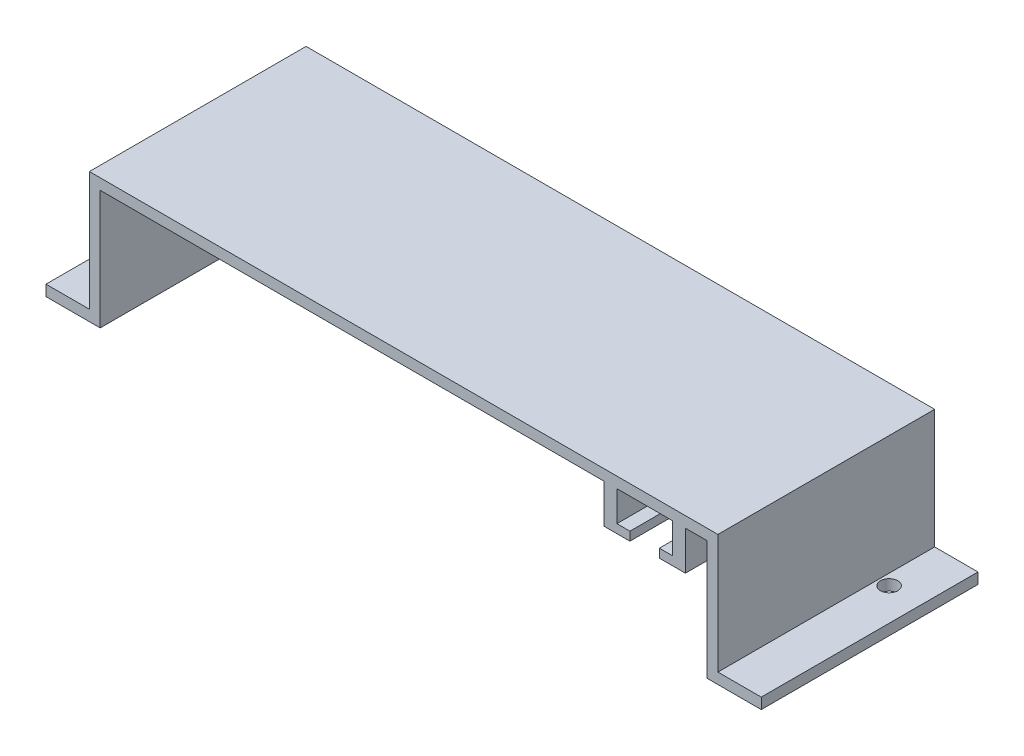
ISO-10303-21;
HEADER;
FILE_DESCRIPTION(('STEP AP214'),'2;1');
FILE_NAME('part.step','',(''),(''),'','','');
FILE_SCHEMA(('AUTOMOTIVE_DESIGN { 1 0 10303 214 1 1 1 1 }'));
ENDSEC;
DATA;
#1=APPLICATION_CONTEXT('core data for automotive mechanical design processes');
#2=APPLICATION_PROTOCOL_DEFINITION('international standard','automotive_design',2000,#1);
#3=PRODUCT_CONTEXT('',#1,'mechanical');
#4=PRODUCT('Part','Part','',(#3));
#5=PRODUCT_RELATED_PRODUCT_CATEGORY('part','',(#4));
#6=PRODUCT_DEFINITION_FORMATION('','',#4);
#7=PRODUCT_DEFINITION_CONTEXT('part definition',#1,'design');
#8=PRODUCT_DEFINITION('design','',#6,#7);
#9=PRODUCT_DEFINITION_SHAPE('','',#8);
#10=(LENGTH_UNIT() NAMED_UNIT(*) SI_UNIT(.MILLI.,.METRE.));
#11=(NAMED_UNIT(*) PLANE_ANGLE_UNIT() SI_UNIT($,.RADIAN.));
#12=(NAMED_UNIT(*) SI_UNIT($,.STERADIAN.) SOLID_ANGLE_UNIT());
#13=UNCERTAINTY_MEASURE_WITH_UNIT(LENGTH_MEASURE(1.E-05),#10,'distance_accuracy_value','');
#14=(GEOMETRIC_REPRESENTATION_CONTEXT(3) GLOBAL_UNCERTAINTY_ASSIGNED_CONTEXT((#13)) GLOBAL_UNIT_ASSIGNED_CONTEXT((#10,
#11,#12)) REPRESENTATION_CONTEXT('',''));
#15=CARTESIAN_POINT('',(0.,0.,0.));
#16=DIRECTION('',(0.,0.,1.));
#17=DIRECTION('',(1.,0.,0.));
#18=AXIS2_PLACEMENT_3D('',#15,#16,#17);
#19=CARTESIAN_POINT('',(0.,0.,0.));
#20=DIRECTION('',(0.,1.,0.));
#21=DIRECTION('',(0.,0.,1.));
#22=AXIS2_PLACEMENT_3D('',#19,#20,#21);
#23=PLANE('',#22);
#24=DIRECTION('',(1.,0.,0.));
#25=VECTOR('',#24,1.);
#26=CARTESIAN_POINT('',(-88.8999999999999,0.,31.75));
#27=LINE('',#26,#25);
#28=CARTESIAN_POINT('',(82.55,0.,31.75));
#29=VERTEX_POINT('',#28);
#30=CARTESIAN_POINT('',(88.9,0.,31.75));
#31=VERTEX_POINT('',#30);
#32=EDGE_CURVE('E237',#29,#31,#27,.T.);
#33=ORIENTED_EDGE('',*,*,#32,.F.);
#34=DIRECTION('',(0.,0.,1.));
#35=VECTOR('',#34,1.);
#36=CARTESIAN_POINT('',(82.55,0.,-45.4871503595178));
#37=LINE('',#36,#35);
#38=CARTESIAN_POINT('',(82.55,0.,-31.75));
#39=VERTEX_POINT('',#38);
#40=EDGE_CURVE('E447',#39,#29,#37,.T.);
#41=ORIENTED_EDGE('',*,*,#40,.F.);
#42=DIRECTION('',(-1.,0.,0.));
#43=VECTOR('',#42,1.);
#44=CARTESIAN_POINT('',(-88.9,0.,-31.75));
#45=LINE('',#44,#43);
#46=CARTESIAN_POINT('',(88.9,0.,-31.75));
#47=VERTEX_POINT('',#46);
#48=EDGE_CURVE('E352',#47,#39,#45,.T.);
#49=ORIENTED_EDGE('',*,*,#48,.F.);
#50=DIRECTION('',(0.,0.,-1.));
#51=VECTOR('',#50,1.);
#52=CARTESIAN_POINT('',(88.9,0.,-31.75));
#53=LINE('',#52,#51);
#54=EDGE_CURVE('E336',#31,#47,#53,.T.);
#55=ORIENTED_EDGE('',*,*,#54,.F.);
#56=EDGE_LOOP('',(#33,#41,#49,#55));
#57=FACE_BOUND('',#56,.T.);
#58=ADVANCED_FACE('F41',(#57),#23,.F.);
#59=CARTESIAN_POINT('',(78.74,0.,-31.75));
#60=VERTEX_POINT('',#59);
#61=CARTESIAN_POINT('',(62.484,0.,-31.75));
#62=VERTEX_POINT('',#61);
#63=EDGE_CURVE('E226',#60,#62,#45,.T.);
#64=ORIENTED_EDGE('',*,*,#63,.F.);
#65=DIRECTION('',(0.,0.,1.));
#66=VECTOR('',#65,1.);
#67=CARTESIAN_POINT('',(78.74,0.,-45.4871503595178));
#68=LINE('',#67,#66);
#69=CARTESIAN_POINT('',(78.74,0.,31.75));
#70=VERTEX_POINT('',#69);
#71=EDGE_CURVE('E211',#60,#70,#68,.T.);
#72=ORIENTED_EDGE('',*,*,#71,.T.);
#73=CARTESIAN_POINT('',(62.484,0.,31.75));
#74=VERTEX_POINT('',#73);
#75=EDGE_CURVE('E225',#74,#70,#27,.T.);
#76=ORIENTED_EDGE('',*,*,#75,.F.);
#77=DIRECTION('',(0.,0.,1.));
#78=VECTOR('',#77,1.);
#79=CARTESIAN_POINT('',(62.484,0.,-45.4871503595178));
#80=LINE('',#79,#78);
#81=EDGE_CURVE('E478',#62,#74,#80,.T.);
#82=ORIENTED_EDGE('',*,*,#81,.F.);
#83=EDGE_LOOP('',(#64,#72,#76,#82));
#84=FACE_BOUND('',#83,.T.);
#85=ADVANCED_FACE('F223',(#84),#23,.F.);
#86=CARTESIAN_POINT('',(-92.0749999999999,-34.925,-31.75));
#87=DIRECTION('',(-1.,0.,0.));
#88=DIRECTION('',(0.,0.,1.));
#89=AXIS2_PLACEMENT_3D('',#86,#87,#88);
#90=PLANE('',#89);
#91=DIRECTION('',(0.,1.,0.));
#92=VECTOR('',#91,1.);
#93=CARTESIAN_POINT('',(-92.0749999999999,-34.925,-31.75));
#94=LINE('',#93,#92);
#95=CARTESIAN_POINT('',(-92.0749999999999,-31.75,-31.75));
#96=VERTEX_POINT('',#95);
#97=CARTESIAN_POINT('',(-92.0749999999999,3.175,-31.75));
#98=VERTEX_POINT('',#97);
#99=EDGE_CURVE('E340',#96,#98,#94,.T.);
#100=ORIENTED_EDGE('',*,*,#99,.F.);
#101=DIRECTION('',(0.,0.,1.));
#102=VECTOR('',#101,1.);
#103=CARTESIAN_POINT('',(-92.0749999999999,-31.75,31.75));
#104=LINE('',#103,#102);
#105=CARTESIAN_POINT('',(-92.0749999999999,-31.75,31.75));
#106=VERTEX_POINT('',#105);
#107=EDGE_CURVE('E382',#96,#106,#104,.T.);
#108=ORIENTED_EDGE('',*,*,#107,.T.);
#109=DIRECTION('',(0.,1.,0.));
#110=VECTOR('',#109,1.);
#111=CARTESIAN_POINT('',(-92.0749999999999,-34.925,31.75));
#112=LINE('',#111,#110);
#113=CARTESIAN_POINT('',(-92.0749999999999,3.175,31.75));
#114=VERTEX_POINT('',#113);
#115=EDGE_CURVE('E337',#106,#114,#112,.T.);
#116=ORIENTED_EDGE('',*,*,#115,.T.);
#117=DIRECTION('',(0.,0.,1.));
#118=VECTOR('',#117,1.);
#119=CARTESIAN_POINT('',(-92.0749999999999,3.175,-31.75));
#120=LINE('',#119,#118);
#121=EDGE_CURVE('E307',#98,#114,#120,.T.);
#122=ORIENTED_EDGE('',*,*,#121,.F.);
#123=EDGE_LOOP('',(#100,#108,#116,#122));
#124=FACE_BOUND('',#123,.T.);
#125=ADVANCED_FACE('F420',(#124),#90,.T.);
#126=CARTESIAN_POINT('',(-88.9,3.175,-31.75));
#127=DIRECTION('',(0.,0.,1.));
#128=DIRECTION('',(1.,0.,0.));
#129=AXIS2_PLACEMENT_3D('',#126,#127,#128);
#130=PLANE('',#129);
#131=ORIENTED_EDGE('',*,*,#48,.T.);
#132=DIRECTION('',(0.,-1.,0.));
#133=VECTOR('',#132,1.);
#134=CARTESIAN_POINT('',(82.55,0.,-31.75));
#135=LINE('',#134,#133);
#136=CARTESIAN_POINT('',(82.55,-11.43,-31.75));
#137=VERTEX_POINT('',#136);
#138=EDGE_CURVE('E473',#39,#137,#135,.T.);
#139=ORIENTED_EDGE('',*,*,#138,.T.);
#140=DIRECTION('',(-1.,0.,0.));
#141=VECTOR('',#140,1.);
#142=CARTESIAN_POINT('',(82.55,-11.43,-31.75));
#143=LINE('',#142,#141);
#144=CARTESIAN_POINT('',(74.93,-11.43,-31.75));
#145=VERTEX_POINT('',#144);
#146=EDGE_CURVE('E834',#137,#145,#143,.T.);
#147=ORIENTED_EDGE('',*,*,#146,.T.);
#148=DIRECTION('',(0.,1.,0.));
#149=VECTOR('',#148,1.);
#150=CARTESIAN_POINT('',(74.93,-11.43,-31.75));
#151=LINE('',#150,#149);
#152=CARTESIAN_POINT('',(74.93,-8.88999999999999,-31.75));
#153=VERTEX_POINT('',#152);
#154=EDGE_CURVE('E455',#145,#153,#151,.T.);
#155=ORIENTED_EDGE('',*,*,#154,.T.);
#156=DIRECTION('',(1.,0.,0.));
#157=VECTOR('',#156,1.);
#158=CARTESIAN_POINT('',(74.93,-8.88999999999999,-31.75));
#159=LINE('',#158,#157);
#160=CARTESIAN_POINT('',(78.74,-8.88999999999998,-31.75));
#161=VERTEX_POINT('',#160);
#162=EDGE_CURVE('E450',#153,#161,#159,.T.);
#163=ORIENTED_EDGE('',*,*,#162,.T.);
#164=DIRECTION('',(0.,1.,0.));
#165=VECTOR('',#164,1.);
#166=CARTESIAN_POINT('',(78.74,-8.88999999999998,-31.75));
#167=LINE('',#166,#165);
#168=EDGE_CURVE('E469',#161,#60,#167,.T.);
#169=ORIENTED_EDGE('',*,*,#168,.T.);
#170=ORIENTED_EDGE('',*,*,#63,.T.);
#171=DIRECTION('',(0.,-1.,0.));
#172=VECTOR('',#171,1.);
#173=CARTESIAN_POINT('',(62.484,-8.88999999999999,-31.75));
#174=LINE('',#173,#172);
#175=CARTESIAN_POINT('',(62.484,-8.88999999999999,-31.75));
#176=VERTEX_POINT('',#175);
#177=EDGE_CURVE('E412',#62,#176,#174,.T.);
#178=ORIENTED_EDGE('',*,*,#177,.T.);
#179=DIRECTION('',(1.,0.,0.));
#180=VECTOR('',#179,1.);
#181=CARTESIAN_POINT('',(66.294,-8.88999999999999,-31.75));
#182=LINE('',#181,#180);
#183=CARTESIAN_POINT('',(66.294,-8.88999999999999,-31.75));
#184=VERTEX_POINT('',#183);
#185=EDGE_CURVE('E481',#176,#184,#182,.T.);
#186=ORIENTED_EDGE('',*,*,#185,.T.);
#187=DIRECTION('',(0.,-1.,0.));
#188=VECTOR('',#187,1.);
#189=CARTESIAN_POINT('',(66.294,-11.43,-31.75));
#190=LINE('',#189,#188);
#191=CARTESIAN_POINT('',(66.294,-11.43,-31.75));
#192=VERTEX_POINT('',#191);
#193=EDGE_CURVE('E477',#184,#192,#190,.T.);
#194=ORIENTED_EDGE('',*,*,#193,.T.);
#195=DIRECTION('',(-1.,0.,0.));
#196=VECTOR('',#195,1.);
#197=CARTESIAN_POINT('',(58.674,-11.43,-31.75));
#198=LINE('',#197,#196);
#199=CARTESIAN_POINT('',(58.674,-11.43,-31.75));
#200=VERTEX_POINT('',#199);
#201=EDGE_CURVE('E474',#192,#200,#198,.T.);
#202=ORIENTED_EDGE('',*,*,#201,.T.);
#203=DIRECTION('',(0.,1.,0.));
#204=VECTOR('',#203,1.);
#205=CARTESIAN_POINT('',(58.674,0.,-31.75));
#206=LINE('',#205,#204);
#207=CARTESIAN_POINT('',(58.674,0.,-31.75));
#208=VERTEX_POINT('',#207);
#209=EDGE_CURVE('E363',#200,#208,#206,.T.);
#210=ORIENTED_EDGE('',*,*,#209,.T.);
#211=CARTESIAN_POINT('',(-88.9,0.,-31.75));
#212=VERTEX_POINT('',#211);
#213=EDGE_CURVE('E351',#208,#212,#45,.T.);
#214=ORIENTED_EDGE('',*,*,#213,.T.);
#215=DIRECTION('',(0.,1.,0.));
#216=VECTOR('',#215,1.);
#217=CARTESIAN_POINT('',(-88.9,-34.925,-31.75));
#218=LINE('',#217,#216);
#219=CARTESIAN_POINT('',(-88.9,-34.925,-31.75));
#220=VERTEX_POINT('',#219);
#221=EDGE_CURVE('E328',#220,#212,#218,.T.);
#222=ORIENTED_EDGE('',*,*,#221,.F.);
#223=DIRECTION('',(-1.,0.,0.));
#224=VECTOR('',#223,1.);
#225=CARTESIAN_POINT('',(-88.9,-34.925,-31.75));
#226=LINE('',#225,#224);
#227=CARTESIAN_POINT('',(-104.775,-34.925,-31.75));
#228=VERTEX_POINT('',#227);
#229=EDGE_CURVE('E321',#220,#228,#226,.T.);
#230=ORIENTED_EDGE('',*,*,#229,.T.);
#231=DIRECTION('',(0.,1.,0.));
#232=VECTOR('',#231,1.);
#233=CARTESIAN_POINT('',(-104.775,-34.925,-31.75));
#234=LINE('',#233,#232);
#235=CARTESIAN_POINT('',(-104.775,-31.75,-31.75));
#236=VERTEX_POINT('',#235);
#237=EDGE_CURVE('E388',#228,#236,#234,.T.);
#238=ORIENTED_EDGE('',*,*,#237,.T.);
#239=DIRECTION('',(1.,0.,0.));
#240=VECTOR('',#239,1.);
#241=CARTESIAN_POINT('',(-104.775,-31.75,-31.75));
#242=LINE('',#241,#240);
#243=EDGE_CURVE('E262',#236,#96,#242,.T.);
#244=ORIENTED_EDGE('',*,*,#243,.T.);
#245=ORIENTED_EDGE('',*,*,#99,.T.);
#246=DIRECTION('',(-1.,0.,0.));
#247=VECTOR('',#246,1.);
#248=CARTESIAN_POINT('',(-88.9,3.175,-31.75));
#249=LINE('',#248,#247);
#250=CARTESIAN_POINT('',(92.0749999999999,3.175,-31.75));
#251=VERTEX_POINT('',#250);
#252=EDGE_CURVE('E51',#251,#98,#249,.T.);
#253=ORIENTED_EDGE('',*,*,#252,.F.);
#254=DIRECTION('',(0.,1.,0.));
#255=VECTOR('',#254,1.);
#256=CARTESIAN_POINT('',(92.0749999999999,-34.925,-31.75));
#257=LINE('',#256,#255);
#258=CARTESIAN_POINT('',(92.0749999999999,-31.75,-31.75));
#259=VERTEX_POINT('',#258);
#260=EDGE_CURVE('E308',#259,#251,#257,.T.);
#261=ORIENTED_EDGE('',*,*,#260,.F.);
#262=DIRECTION('',(-1.,0.,0.));
#263=VECTOR('',#262,1.);
#264=CARTESIAN_POINT('',(104.775,-31.75,-31.75));
#265=LINE('',#264,#263);
#266=CARTESIAN_POINT('',(104.775,-31.75,-31.75));
#267=VERTEX_POINT('',#266);
#268=EDGE_CURVE('E283',#267,#259,#265,.T.);
#269=ORIENTED_EDGE('',*,*,#268,.F.);
#270=DIRECTION('',(0.,1.,0.));
#271=VECTOR('',#270,1.);
#272=CARTESIAN_POINT('',(104.775,-34.925,-31.75));
#273=LINE('',#272,#271);
#274=CARTESIAN_POINT('',(104.775,-34.925,-31.75));
#275=VERTEX_POINT('',#274);
#276=EDGE_CURVE('E273',#275,#267,#273,.T.);
#277=ORIENTED_EDGE('',*,*,#276,.F.);
#278=DIRECTION('',(-1.,0.,0.));
#279=VECTOR('',#278,1.);
#280=CARTESIAN_POINT('',(88.9,-34.925,-31.75));
#281=LINE('',#280,#279);
#282=CARTESIAN_POINT('',(88.9,-34.925,-31.75));
#283=VERTEX_POINT('',#282);
#284=EDGE_CURVE('E295',#275,#283,#281,.T.);
#285=ORIENTED_EDGE('',*,*,#284,.T.);
#286=DIRECTION('',(0.,1.,0.));
#287=VECTOR('',#286,1.);
#288=CARTESIAN_POINT('',(88.9,-34.925,-31.75));
#289=LINE('',#288,#287);
#290=EDGE_CURVE('E303',#283,#47,#289,.T.);
#291=ORIENTED_EDGE('',*,*,#290,.T.);
#292=EDGE_LOOP('',(#131,#139,#147,#155,#163,#169,#170,#178,#186,#194,#202,#210,#214,#222,#230,
#238,#244,#245,#253,#261,#269,#277,#285,#291));
#293=FACE_BOUND('',#292,.T.);
#294=ADVANCED_FACE('F43',(#293),#130,.F.);
#295=CARTESIAN_POINT('',(-88.8999999999999,3.175,31.75));
#296=DIRECTION('',(0.,0.,-1.));
#297=DIRECTION('',(-1.,0.,0.));
#298=AXIS2_PLACEMENT_3D('',#295,#296,#297);
#299=PLANE('',#298);
#300=CARTESIAN_POINT('',(-88.8999999999999,0.,31.75));
#301=VERTEX_POINT('',#300);
#302=CARTESIAN_POINT('',(58.674,0.,31.75));
#303=VERTEX_POINT('',#302);
#304=EDGE_CURVE('E236',#301,#303,#27,.T.);
#305=ORIENTED_EDGE('',*,*,#304,.T.);
#306=DIRECTION('',(0.,-1.,0.));
#307=VECTOR('',#306,1.);
#308=CARTESIAN_POINT('',(58.674,0.,31.75));
#309=LINE('',#308,#307);
#310=CARTESIAN_POINT('',(58.674,-11.43,31.75));
#311=VERTEX_POINT('',#310);
#312=EDGE_CURVE('E472',#303,#311,#309,.T.);
#313=ORIENTED_EDGE('',*,*,#312,.T.);
#314=DIRECTION('',(1.,0.,0.));
#315=VECTOR('',#314,1.);
#316=CARTESIAN_POINT('',(58.674,-11.43,31.75));
#317=LINE('',#316,#315);
#318=CARTESIAN_POINT('',(66.294,-11.43,31.75));
#319=VERTEX_POINT('',#318);
#320=EDGE_CURVE('E489',#311,#319,#317,.T.);
#321=ORIENTED_EDGE('',*,*,#320,.T.);
#322=DIRECTION('',(0.,1.,0.));
#323=VECTOR('',#322,1.);
#324=CARTESIAN_POINT('',(66.294,-11.43,31.75));
#325=LINE('',#324,#323);
#326=CARTESIAN_POINT('',(66.294,-8.88999999999999,31.75));
#327=VERTEX_POINT('',#326);
#328=EDGE_CURVE('E493',#319,#327,#325,.T.);
#329=ORIENTED_EDGE('',*,*,#328,.T.);
#330=DIRECTION('',(-1.,0.,0.));
#331=VECTOR('',#330,1.);
#332=CARTESIAN_POINT('',(66.294,-8.88999999999999,31.75));
#333=LINE('',#332,#331);
#334=CARTESIAN_POINT('',(62.484,-8.88999999999999,31.75));
#335=VERTEX_POINT('',#334);
#336=EDGE_CURVE('E497',#327,#335,#333,.T.);
#337=ORIENTED_EDGE('',*,*,#336,.T.);
#338=DIRECTION('',(0.,1.,0.));
#339=VECTOR('',#338,1.);
#340=CARTESIAN_POINT('',(62.484,-8.88999999999999,31.75));
#341=LINE('',#340,#339);
#342=EDGE_CURVE('E234',#335,#74,#341,.T.);
#343=ORIENTED_EDGE('',*,*,#342,.T.);
#344=ORIENTED_EDGE('',*,*,#75,.T.);
#345=DIRECTION('',(0.,-1.,0.));
#346=VECTOR('',#345,1.);
#347=CARTESIAN_POINT('',(78.74,-8.88999999999998,31.75));
#348=LINE('',#347,#346);
#349=CARTESIAN_POINT('',(78.74,-8.88999999999998,31.75));
#350=VERTEX_POINT('',#349);
#351=EDGE_CURVE('E207',#70,#350,#348,.T.);
#352=ORIENTED_EDGE('',*,*,#351,.T.);
#353=DIRECTION('',(-1.,0.,0.));
#354=VECTOR('',#353,1.);
#355=CARTESIAN_POINT('',(74.93,-8.88999999999999,31.75));
#356=LINE('',#355,#354);
#357=CARTESIAN_POINT('',(74.93,-8.88999999999999,31.75));
#358=VERTEX_POINT('',#357);
#359=EDGE_CURVE('E219',#350,#358,#356,.T.);
#360=ORIENTED_EDGE('',*,*,#359,.T.);
#361=DIRECTION('',(0.,-1.,0.));
#362=VECTOR('',#361,1.);
#363=CARTESIAN_POINT('',(74.93,-11.43,31.75));
#364=LINE('',#363,#362);
#365=CARTESIAN_POINT('',(74.93,-11.43,31.75));
#366=VERTEX_POINT('',#365);
#367=EDGE_CURVE('E822',#358,#366,#364,.T.);
#368=ORIENTED_EDGE('',*,*,#367,.T.);
#369=DIRECTION('',(1.,0.,0.));
#370=VECTOR('',#369,1.);
#371=CARTESIAN_POINT('',(82.55,-11.43,31.75));
#372=LINE('',#371,#370);
#373=CARTESIAN_POINT('',(82.55,-11.43,31.75));
#374=VERTEX_POINT('',#373);
#375=EDGE_CURVE('E825',#366,#374,#372,.T.);
#376=ORIENTED_EDGE('',*,*,#375,.T.);
#377=DIRECTION('',(0.,1.,0.));
#378=VECTOR('',#377,1.);
#379=CARTESIAN_POINT('',(82.55,0.,31.75));
#380=LINE('',#379,#378);
#381=EDGE_CURVE('E59',#374,#29,#380,.T.);
#382=ORIENTED_EDGE('',*,*,#381,.T.);
#383=ORIENTED_EDGE('',*,*,#32,.T.);
#384=DIRECTION('',(0.,1.,0.));
#385=VECTOR('',#384,1.);
#386=CARTESIAN_POINT('',(88.8999999999999,-34.925,31.75));
#387=LINE('',#386,#385);
#388=CARTESIAN_POINT('',(88.8999999999999,-34.925,31.75));
#389=VERTEX_POINT('',#388);
#390=EDGE_CURVE('E299',#389,#31,#387,.T.);
#391=ORIENTED_EDGE('',*,*,#390,.F.);
#392=DIRECTION('',(1.,0.,0.));
#393=VECTOR('',#392,1.);
#394=CARTESIAN_POINT('',(88.8999999999999,-34.925,31.75));
#395=LINE('',#394,#393);
#396=CARTESIAN_POINT('',(104.775,-34.925,31.75));
#397=VERTEX_POINT('',#396);
#398=EDGE_CURVE('E292',#389,#397,#395,.T.);
#399=ORIENTED_EDGE('',*,*,#398,.T.);
#400=DIRECTION('',(0.,-1.,0.));
#401=VECTOR('',#400,1.);
#402=CARTESIAN_POINT('',(104.775,-34.925,31.75));
#403=LINE('',#402,#401);
#404=CARTESIAN_POINT('',(104.775,-31.75,31.75));
#405=VERTEX_POINT('',#404);
#406=EDGE_CURVE('E254',#405,#397,#403,.T.);
#407=ORIENTED_EDGE('',*,*,#406,.F.);
#408=DIRECTION('',(-1.,0.,0.));
#409=VECTOR('',#408,1.);
#410=CARTESIAN_POINT('',(104.775,-31.75,31.75));
#411=LINE('',#410,#409);
#412=CARTESIAN_POINT('',(92.0749999999999,-31.75,31.75));
#413=VERTEX_POINT('',#412);
#414=EDGE_CURVE('E278',#405,#413,#411,.T.);
#415=ORIENTED_EDGE('',*,*,#414,.T.);
#416=DIRECTION('',(0.,1.,0.));
#417=VECTOR('',#416,1.);
#418=CARTESIAN_POINT('',(92.0749999999999,-34.925,31.75));
#419=LINE('',#418,#417);
#420=CARTESIAN_POINT('',(92.0749999999999,3.175,31.75));
#421=VERTEX_POINT('',#420);
#422=EDGE_CURVE('E311',#413,#421,#419,.T.);
#423=ORIENTED_EDGE('',*,*,#422,.T.);
#424=DIRECTION('',(1.,0.,0.));
#425=VECTOR('',#424,1.);
#426=CARTESIAN_POINT('',(-88.8999999999999,3.175,31.75));
#427=LINE('',#426,#425);
#428=EDGE_CURVE('E11',#114,#421,#427,.T.);
#429=ORIENTED_EDGE('',*,*,#428,.F.);
#430=ORIENTED_EDGE('',*,*,#115,.F.);
#431=DIRECTION('',(1.,0.,0.));
#432=VECTOR('',#431,1.);
#433=CARTESIAN_POINT('',(-104.775,-31.75,31.75));
#434=LINE('',#433,#432);
#435=CARTESIAN_POINT('',(-104.775,-31.75,31.75));
#436=VERTEX_POINT('',#435);
#437=EDGE_CURVE('E257',#436,#106,#434,.T.);
#438=ORIENTED_EDGE('',*,*,#437,.F.);
#439=DIRECTION('',(0.,-1.,0.));
#440=VECTOR('',#439,1.);
#441=CARTESIAN_POINT('',(-104.775,-34.925,31.75));
#442=LINE('',#441,#440);
#443=CARTESIAN_POINT('',(-104.775,-34.925,31.75));
#444=VERTEX_POINT('',#443);
#445=EDGE_CURVE('E374',#436,#444,#442,.T.);
#446=ORIENTED_EDGE('',*,*,#445,.T.);
#447=DIRECTION('',(1.,0.,0.));
#448=VECTOR('',#447,1.);
#449=CARTESIAN_POINT('',(-88.8999999999999,-34.925,31.75));
#450=LINE('',#449,#448);
#451=CARTESIAN_POINT('',(-88.8999999999999,-34.925,31.75));
#452=VERTEX_POINT('',#451);
#453=EDGE_CURVE('E324',#444,#452,#450,.T.);
#454=ORIENTED_EDGE('',*,*,#453,.T.);
#455=DIRECTION('',(0.,1.,0.));
#456=VECTOR('',#455,1.);
#457=CARTESIAN_POINT('',(-88.8999999999999,-34.925,31.75));
#458=LINE('',#457,#456);
#459=EDGE_CURVE('E332',#452,#301,#458,.T.);
#460=ORIENTED_EDGE('',*,*,#459,.T.);
#461=EDGE_LOOP('',(#305,#313,#321,#329,#337,#343,#344,#352,#360,#368,#376,#382,#383,#391,#399,
#407,#415,#423,#429,#430,#438,#446,#454,#460));
#462=FACE_BOUND('',#461,.T.);
#463=ADVANCED_FACE('F231',(#462),#299,.F.);
#464=CARTESIAN_POINT('',(0.,3.175,0.));
#465=DIRECTION('',(0.,1.,0.));
#466=DIRECTION('',(0.,0.,1.));
#467=AXIS2_PLACEMENT_3D('',#464,#465,#466);
#468=PLANE('',#467);
#469=ORIENTED_EDGE('',*,*,#428,.T.);
#470=DIRECTION('',(0.,0.,-1.));
#471=VECTOR('',#470,1.);
#472=CARTESIAN_POINT('',(92.0749999999999,3.175,-31.75));
#473=LINE('',#472,#471);
#474=EDGE_CURVE('E287',#421,#251,#473,.T.);
#475=ORIENTED_EDGE('',*,*,#474,.T.);
#476=ORIENTED_EDGE('',*,*,#252,.T.);
#477=ORIENTED_EDGE('',*,*,#121,.T.);
#478=EDGE_LOOP('',(#469,#475,#476,#477));
#479=FACE_BOUND('',#478,.T.);
#480=ADVANCED_FACE('F423',(#479),#468,.T.);
#481=ORIENTED_EDGE('',*,*,#213,.F.);
#482=DIRECTION('',(0.,0.,1.));
#483=VECTOR('',#482,1.);
#484=CARTESIAN_POINT('',(58.674,0.,-45.4871503595178));
#485=LINE('',#484,#483);
#486=EDGE_CURVE('E67',#208,#303,#485,.T.);
#487=ORIENTED_EDGE('',*,*,#486,.T.);
#488=ORIENTED_EDGE('',*,*,#304,.F.);
#489=DIRECTION('',(0.,0.,1.));
#490=VECTOR('',#489,1.);
#491=CARTESIAN_POINT('',(-88.9,0.,-31.75));
#492=LINE('',#491,#490);
#493=EDGE_CURVE('E241',#212,#301,#492,.T.);
#494=ORIENTED_EDGE('',*,*,#493,.F.);
#495=EDGE_LOOP('',(#481,#487,#488,#494));
#496=FACE_BOUND('',#495,.T.);
#497=ADVANCED_FACE('F365',(#496),#23,.F.);
#498=CARTESIAN_POINT('',(-88.9,-34.925,-31.75));
#499=DIRECTION('',(1.,0.,0.));
#500=DIRECTION('',(0.,0.,-1.));
#501=AXIS2_PLACEMENT_3D('',#498,#499,#500);
#502=PLANE('',#501);
#503=ORIENTED_EDGE('',*,*,#221,.T.);
#504=ORIENTED_EDGE('',*,*,#493,.T.);
#505=ORIENTED_EDGE('',*,*,#459,.F.);
#506=DIRECTION('',(0.,0.,-1.));
#507=VECTOR('',#506,1.);
#508=CARTESIAN_POINT('',(-88.9,-34.925,-31.75));
#509=LINE('',#508,#507);
#510=EDGE_CURVE('E317',#452,#220,#509,.T.);
#511=ORIENTED_EDGE('',*,*,#510,.T.);
#512=EDGE_LOOP('',(#503,#504,#505,#511));
#513=FACE_BOUND('',#512,.T.);
#514=ADVANCED_FACE('F367',(#513),#502,.T.);
#515=CARTESIAN_POINT('',(0.,-34.925,0.));
#516=DIRECTION('',(0.,-1.,0.));
#517=DIRECTION('',(0.,0.,-1.));
#518=AXIS2_PLACEMENT_3D('',#515,#516,#517);
#519=PLANE('',#518);
#520=CARTESIAN_POINT('',(-95.25,-34.925,-15.24));
#521=DIRECTION('',(0.,1.,0.));
#522=DIRECTION('',(0.,0.,-1.));
#523=AXIS2_PLACEMENT_3D('',#520,#521,#522);
#524=CIRCLE('',#523,2.54);
#525=CARTESIAN_POINT('',(-95.25,-34.925,-17.78));
#526=VERTEX_POINT('',#525);
#527=EDGE_CURVE('E403',#526,#526,#524,.T.);
#528=ORIENTED_EDGE('',*,*,#527,.T.);
#529=EDGE_LOOP('',(#528));
#530=FACE_BOUND('',#529,.T.);
#531=ORIENTED_EDGE('',*,*,#510,.F.);
#532=ORIENTED_EDGE('',*,*,#453,.F.);
#533=DIRECTION('',(0.,0.,-1.));
#534=VECTOR('',#533,1.);
#535=CARTESIAN_POINT('',(-104.775,-34.925,31.75));
#536=LINE('',#535,#534);
#537=EDGE_CURVE('E385',#444,#228,#536,.T.);
#538=ORIENTED_EDGE('',*,*,#537,.T.);
#539=ORIENTED_EDGE('',*,*,#229,.F.);
#540=EDGE_LOOP('',(#531,#532,#538,#539));
#541=FACE_BOUND('',#540,.T.);
#542=ADVANCED_FACE('F370',(#530,#541),#519,.T.);
#543=CARTESIAN_POINT('',(88.9,-34.925,-31.75));
#544=DIRECTION('',(-1.,0.,0.));
#545=DIRECTION('',(0.,0.,1.));
#546=AXIS2_PLACEMENT_3D('',#543,#544,#545);
#547=PLANE('',#546);
#548=ORIENTED_EDGE('',*,*,#390,.T.);
#549=ORIENTED_EDGE('',*,*,#54,.T.);
#550=ORIENTED_EDGE('',*,*,#290,.F.);
#551=DIRECTION('',(0.,0.,1.));
#552=VECTOR('',#551,1.);
#553=CARTESIAN_POINT('',(88.9,-34.925,-31.75));
#554=LINE('',#553,#552);
#555=EDGE_CURVE('E288',#283,#389,#554,.T.);
#556=ORIENTED_EDGE('',*,*,#555,.T.);
#557=EDGE_LOOP('',(#548,#549,#550,#556));
#558=FACE_BOUND('',#557,.T.);
#559=ADVANCED_FACE('F442',(#558),#547,.T.);
#560=CARTESIAN_POINT('',(92.0749999999999,-34.925,-31.75));
#561=DIRECTION('',(1.,0.,0.));
#562=DIRECTION('',(0.,0.,-1.));
#563=AXIS2_PLACEMENT_3D('',#560,#561,#562);
#564=PLANE('',#563);
#565=DIRECTION('',(0.,0.,1.));
#566=VECTOR('',#565,1.);
#567=CARTESIAN_POINT('',(92.0749999999999,-31.75,31.75));
#568=LINE('',#567,#566);
#569=EDGE_CURVE('E247',#259,#413,#568,.T.);
#570=ORIENTED_EDGE('',*,*,#569,.F.);
#571=ORIENTED_EDGE('',*,*,#260,.T.);
#572=ORIENTED_EDGE('',*,*,#474,.F.);
#573=ORIENTED_EDGE('',*,*,#422,.F.);
#574=EDGE_LOOP('',(#570,#571,#572,#573));
#575=FACE_BOUND('',#574,.T.);
#576=ADVANCED_FACE('F567',(#575),#564,.T.);
#577=CARTESIAN_POINT('',(0.,-34.925,0.));
#578=DIRECTION('',(0.,1.,0.));
#579=DIRECTION('',(0.,0.,1.));
#580=AXIS2_PLACEMENT_3D('',#577,#578,#579);
#581=PLANE('',#580);
#582=CARTESIAN_POINT('',(95.25,-34.925,-15.24));
#583=DIRECTION('',(0.,-1.,0.));
#584=DIRECTION('',(0.,0.,-1.));
#585=AXIS2_PLACEMENT_3D('',#582,#583,#584);
#586=CIRCLE('',#585,2.54);
#587=CARTESIAN_POINT('',(95.25,-34.925,-17.78));
#588=VERTEX_POINT('',#587);
#589=EDGE_CURVE('E248',#588,#588,#586,.T.);
#590=ORIENTED_EDGE('',*,*,#589,.F.);
#591=EDGE_LOOP('',(#590));
#592=FACE_BOUND('',#591,.T.);
#593=ORIENTED_EDGE('',*,*,#555,.F.);
#594=ORIENTED_EDGE('',*,*,#284,.F.);
#595=DIRECTION('',(0.,0.,-1.));
#596=VECTOR('',#595,1.);
#597=CARTESIAN_POINT('',(104.775,-34.925,31.75));
#598=LINE('',#597,#596);
#599=EDGE_CURVE('E269',#397,#275,#598,.T.);
#600=ORIENTED_EDGE('',*,*,#599,.F.);
#601=ORIENTED_EDGE('',*,*,#398,.F.);
#602=EDGE_LOOP('',(#593,#594,#600,#601));
#603=FACE_BOUND('',#602,.T.);
#604=ADVANCED_FACE('F439',(#592,#603),#581,.F.);
#605=CARTESIAN_POINT('',(104.775,-31.75,31.75));
#606=DIRECTION('',(0.,-1.,0.));
#607=DIRECTION('',(0.,0.,-1.));
#608=AXIS2_PLACEMENT_3D('',#605,#606,#607);
#609=PLANE('',#608);
#610=CARTESIAN_POINT('',(95.25,-31.75,-15.24));
#611=DIRECTION('',(0.,-1.,0.));
#612=DIRECTION('',(0.,0.,-1.));
#613=AXIS2_PLACEMENT_3D('',#610,#611,#612);
#614=CIRCLE('',#613,2.54);
#615=CARTESIAN_POINT('',(95.25,-31.75,-17.78));
#616=VERTEX_POINT('',#615);
#617=EDGE_CURVE('E244',#616,#616,#614,.T.);
#618=ORIENTED_EDGE('',*,*,#617,.T.);
#619=EDGE_LOOP('',(#618));
#620=FACE_BOUND('',#619,.T.);
#621=ORIENTED_EDGE('',*,*,#569,.T.);
#622=ORIENTED_EDGE('',*,*,#414,.F.);
#623=DIRECTION('',(0.,0.,1.));
#624=VECTOR('',#623,1.);
#625=CARTESIAN_POINT('',(104.775,-31.75,31.75));
#626=LINE('',#625,#624);
#627=EDGE_CURVE('E276',#267,#405,#626,.T.);
#628=ORIENTED_EDGE('',*,*,#627,.F.);
#629=ORIENTED_EDGE('',*,*,#268,.T.);
#630=EDGE_LOOP('',(#621,#622,#628,#629));
#631=FACE_BOUND('',#630,.T.);
#632=ADVANCED_FACE('F431',(#620,#631),#609,.F.);
#633=CARTESIAN_POINT('',(104.775,0.,0.));
#634=DIRECTION('',(-1.,0.,0.));
#635=DIRECTION('',(0.,0.,1.));
#636=AXIS2_PLACEMENT_3D('',#633,#634,#635);
#637=PLANE('',#636);
#638=ORIENTED_EDGE('',*,*,#406,.T.);
#639=ORIENTED_EDGE('',*,*,#599,.T.);
#640=ORIENTED_EDGE('',*,*,#276,.T.);
#641=ORIENTED_EDGE('',*,*,#627,.T.);
#642=EDGE_LOOP('',(#638,#639,#640,#641));
#643=FACE_BOUND('',#642,.T.);
#644=ADVANCED_FACE('F435',(#643),#637,.F.);
#645=CARTESIAN_POINT('',(95.25,-22.225,-15.24));
#646=DIRECTION('',(0.,-1.,0.));
#647=DIRECTION('',(0.,0.,-1.));
#648=AXIS2_PLACEMENT_3D('',#645,#646,#647);
#649=CYLINDRICAL_SURFACE('',#648,2.54);
#650=ORIENTED_EDGE('',*,*,#589,.T.);
#651=EDGE_LOOP('',(#650));
#652=FACE_BOUND('',#651,.T.);
#653=ORIENTED_EDGE('',*,*,#617,.F.);
#654=EDGE_LOOP('',(#653));
#655=FACE_BOUND('',#654,.T.);
#656=ADVANCED_FACE('F577',(#652,#655),#649,.F.);
#657=CARTESIAN_POINT('',(-104.775,-31.75,31.75));
#658=DIRECTION('',(0.,1.,0.));
#659=DIRECTION('',(0.,0.,1.));
#660=AXIS2_PLACEMENT_3D('',#657,#658,#659);
#661=PLANE('',#660);
#662=CARTESIAN_POINT('',(-95.25,-31.75,-15.24));
#663=DIRECTION('',(0.,1.,0.));
#664=DIRECTION('',(0.,0.,1.));
#665=AXIS2_PLACEMENT_3D('',#662,#663,#664);
#666=CIRCLE('',#665,2.54);
#667=CARTESIAN_POINT('',(-95.25,-31.75,-12.7));
#668=VERTEX_POINT('',#667);
#669=EDGE_CURVE('E45',#668,#668,#666,.F.);
#670=ORIENTED_EDGE('',*,*,#669,.T.);
#671=EDGE_LOOP('',(#670));
#672=FACE_BOUND('',#671,.T.);
#673=ORIENTED_EDGE('',*,*,#107,.F.);
#674=ORIENTED_EDGE('',*,*,#243,.F.);
#675=DIRECTION('',(0.,0.,1.));
#676=VECTOR('',#675,1.);
#677=CARTESIAN_POINT('',(-104.775,-31.75,31.75));
#678=LINE('',#677,#676);
#679=EDGE_CURVE('E381',#236,#436,#678,.T.);
#680=ORIENTED_EDGE('',*,*,#679,.T.);
#681=ORIENTED_EDGE('',*,*,#437,.T.);
#682=EDGE_LOOP('',(#673,#674,#680,#681));
#683=FACE_BOUND('',#682,.T.);
#684=ADVANCED_FACE('F417',(#672,#683),#661,.T.);
#685=CARTESIAN_POINT('',(-104.775,0.,0.));
#686=DIRECTION('',(1.,0.,0.));
#687=DIRECTION('',(0.,0.,1.));
#688=AXIS2_PLACEMENT_3D('',#685,#686,#687);
#689=PLANE('',#688);
#690=ORIENTED_EDGE('',*,*,#445,.F.);
#691=ORIENTED_EDGE('',*,*,#679,.F.);
#692=ORIENTED_EDGE('',*,*,#237,.F.);
#693=ORIENTED_EDGE('',*,*,#537,.F.);
#694=EDGE_LOOP('',(#690,#691,#692,#693));
#695=FACE_BOUND('',#694,.T.);
#696=ADVANCED_FACE('F386',(#695),#689,.F.);
#697=CARTESIAN_POINT('',(-95.25,-22.225,-15.24));
#698=DIRECTION('',(0.,-1.,0.));
#699=DIRECTION('',(0.,0.,-1.));
#700=AXIS2_PLACEMENT_3D('',#697,#698,#699);
#701=CYLINDRICAL_SURFACE('',#700,2.54);
#702=ORIENTED_EDGE('',*,*,#669,.F.);
#703=EDGE_LOOP('',(#702));
#704=FACE_BOUND('',#703,.T.);
#705=ORIENTED_EDGE('',*,*,#527,.F.);
#706=EDGE_LOOP('',(#705));
#707=FACE_BOUND('',#706,.T.);
#708=ADVANCED_FACE('F543',(#704,#707),#701,.F.);
#709=CARTESIAN_POINT('',(62.484,-8.88999999999999,-45.4871503595178));
#710=DIRECTION('',(1.,0.,0.));
#711=DIRECTION('',(0.,1.,0.));
#712=AXIS2_PLACEMENT_3D('',#709,#710,#711);
#713=PLANE('',#712);
#714=ORIENTED_EDGE('',*,*,#177,.F.);
#715=ORIENTED_EDGE('',*,*,#81,.T.);
#716=ORIENTED_EDGE('',*,*,#342,.F.);
#717=DIRECTION('',(0.,0.,1.));
#718=VECTOR('',#717,1.);
#719=CARTESIAN_POINT('',(62.484,-8.88999999999999,-45.4871503595178));
#720=LINE('',#719,#718);
#721=EDGE_CURVE('E504',#176,#335,#720,.T.);
#722=ORIENTED_EDGE('',*,*,#721,.F.);
#723=EDGE_LOOP('',(#714,#715,#716,#722));
#724=FACE_BOUND('',#723,.T.);
#725=ADVANCED_FACE('F533',(#724),#713,.T.);
#726=CARTESIAN_POINT('',(66.294,-8.88999999999999,-45.4871503595178));
#727=DIRECTION('',(0.,1.,0.));
#728=DIRECTION('',(0.,0.,1.));
#729=AXIS2_PLACEMENT_3D('',#726,#727,#728);
#730=PLANE('',#729);
#731=ORIENTED_EDGE('',*,*,#185,.F.);
#732=ORIENTED_EDGE('',*,*,#721,.T.);
#733=ORIENTED_EDGE('',*,*,#336,.F.);
#734=DIRECTION('',(0.,0.,1.));
#735=VECTOR('',#734,1.);
#736=CARTESIAN_POINT('',(66.294,-8.88999999999999,-45.4871503595178));
#737=LINE('',#736,#735);
#738=EDGE_CURVE('E507',#184,#327,#737,.T.);
#739=ORIENTED_EDGE('',*,*,#738,.F.);
#740=EDGE_LOOP('',(#731,#732,#733,#739));
#741=FACE_BOUND('',#740,.T.);
#742=ADVANCED_FACE('F535',(#741),#730,.T.);
#743=CARTESIAN_POINT('',(66.294,-11.43,-45.4871503595178));
#744=DIRECTION('',(1.,0.,0.));
#745=DIRECTION('',(0.,0.,-1.));
#746=AXIS2_PLACEMENT_3D('',#743,#744,#745);
#747=PLANE('',#746);
#748=ORIENTED_EDGE('',*,*,#193,.F.);
#749=ORIENTED_EDGE('',*,*,#738,.T.);
#750=ORIENTED_EDGE('',*,*,#328,.F.);
#751=DIRECTION('',(0.,0.,1.));
#752=VECTOR('',#751,1.);
#753=CARTESIAN_POINT('',(66.294,-11.43,-45.4871503595178));
#754=LINE('',#753,#752);
#755=EDGE_CURVE('E510',#192,#319,#754,.T.);
#756=ORIENTED_EDGE('',*,*,#755,.F.);
#757=EDGE_LOOP('',(#748,#749,#750,#756));
#758=FACE_BOUND('',#757,.T.);
#759=ADVANCED_FACE('F526',(#758),#747,.T.);
#760=CARTESIAN_POINT('',(58.674,-11.43,-45.4871503595178));
#761=DIRECTION('',(0.,-1.,0.));
#762=DIRECTION('',(0.,0.,-1.));
#763=AXIS2_PLACEMENT_3D('',#760,#761,#762);
#764=PLANE('',#763);
#765=ORIENTED_EDGE('',*,*,#201,.F.);
#766=ORIENTED_EDGE('',*,*,#755,.T.);
#767=ORIENTED_EDGE('',*,*,#320,.F.);
#768=DIRECTION('',(0.,0.,1.));
#769=VECTOR('',#768,1.);
#770=CARTESIAN_POINT('',(58.674,-11.43,-45.4871503595178));
#771=LINE('',#770,#769);
#772=EDGE_CURVE('E513',#200,#311,#771,.T.);
#773=ORIENTED_EDGE('',*,*,#772,.F.);
#774=EDGE_LOOP('',(#765,#766,#767,#773));
#775=FACE_BOUND('',#774,.T.);
#776=ADVANCED_FACE('F521',(#775),#764,.T.);
#777=CARTESIAN_POINT('',(58.674,0.,-45.4871503595178));
#778=DIRECTION('',(-1.,0.,0.));
#779=DIRECTION('',(0.,0.,1.));
#780=AXIS2_PLACEMENT_3D('',#777,#778,#779);
#781=PLANE('',#780);
#782=ORIENTED_EDGE('',*,*,#209,.F.);
#783=ORIENTED_EDGE('',*,*,#772,.T.);
#784=ORIENTED_EDGE('',*,*,#312,.F.);
#785=ORIENTED_EDGE('',*,*,#486,.F.);
#786=EDGE_LOOP('',(#782,#783,#784,#785));
#787=FACE_BOUND('',#786,.T.);
#788=ADVANCED_FACE('F517',(#787),#781,.T.);
#789=CARTESIAN_POINT('',(82.55,0.,-45.4871503595178));
#790=DIRECTION('',(1.,0.,0.));
#791=DIRECTION('',(0.,0.,-1.));
#792=AXIS2_PLACEMENT_3D('',#789,#790,#791);
#793=PLANE('',#792);
#794=ORIENTED_EDGE('',*,*,#138,.F.);
#795=ORIENTED_EDGE('',*,*,#40,.T.);
#796=ORIENTED_EDGE('',*,*,#381,.F.);
#797=DIRECTION('',(0.,0.,1.));
#798=VECTOR('',#797,1.);
#799=CARTESIAN_POINT('',(82.55,-11.43,-45.4871503595178));
#800=LINE('',#799,#798);
#801=EDGE_CURVE('E451',#137,#374,#800,.T.);
#802=ORIENTED_EDGE('',*,*,#801,.F.);
#803=EDGE_LOOP('',(#794,#795,#796,#802));
#804=FACE_BOUND('',#803,.T.);
#805=ADVANCED_FACE('F589',(#804),#793,.T.);
#806=CARTESIAN_POINT('',(82.55,-11.43,-45.4871503595178));
#807=DIRECTION('',(0.,-1.,0.));
#808=DIRECTION('',(1.,0.,0.));
#809=AXIS2_PLACEMENT_3D('',#806,#807,#808);
#810=PLANE('',#809);
#811=ORIENTED_EDGE('',*,*,#146,.F.);
#812=ORIENTED_EDGE('',*,*,#801,.T.);
#813=ORIENTED_EDGE('',*,*,#375,.F.);
#814=DIRECTION('',(0.,0.,1.));
#815=VECTOR('',#814,1.);
#816=CARTESIAN_POINT('',(74.93,-11.43,-45.4871503595178));
#817=LINE('',#816,#815);
#818=EDGE_CURVE('E457',#145,#366,#817,.T.);
#819=ORIENTED_EDGE('',*,*,#818,.F.);
#820=EDGE_LOOP('',(#811,#812,#813,#819));
#821=FACE_BOUND('',#820,.T.);
#822=ADVANCED_FACE('F605',(#821),#810,.T.);
#823=CARTESIAN_POINT('',(74.93,-11.43,-45.4871503595178));
#824=DIRECTION('',(-1.,0.,0.));
#825=DIRECTION('',(0.,0.,1.));
#826=AXIS2_PLACEMENT_3D('',#823,#824,#825);
#827=PLANE('',#826);
#828=ORIENTED_EDGE('',*,*,#154,.F.);
#829=ORIENTED_EDGE('',*,*,#818,.T.);
#830=ORIENTED_EDGE('',*,*,#367,.F.);
#831=DIRECTION('',(0.,0.,1.));
#832=VECTOR('',#831,1.);
#833=CARTESIAN_POINT('',(74.93,-8.88999999999999,-45.4871503595178));
#834=LINE('',#833,#832);
#835=EDGE_CURVE('E464',#153,#358,#834,.T.);
#836=ORIENTED_EDGE('',*,*,#835,.F.);
#837=EDGE_LOOP('',(#828,#829,#830,#836));
#838=FACE_BOUND('',#837,.T.);
#839=ADVANCED_FACE('F612',(#838),#827,.T.);
#840=CARTESIAN_POINT('',(74.93,-8.88999999999999,-45.4871503595178));
#841=DIRECTION('',(0.,1.,0.));
#842=DIRECTION('',(-1.,0.,0.));
#843=AXIS2_PLACEMENT_3D('',#840,#841,#842);
#844=PLANE('',#843);
#845=ORIENTED_EDGE('',*,*,#162,.F.);
#846=ORIENTED_EDGE('',*,*,#835,.T.);
#847=ORIENTED_EDGE('',*,*,#359,.F.);
#848=DIRECTION('',(0.,0.,1.));
#849=VECTOR('',#848,1.);
#850=CARTESIAN_POINT('',(78.74,-8.88999999999998,-45.4871503595178));
#851=LINE('',#850,#849);
#852=EDGE_CURVE('E214',#161,#350,#851,.T.);
#853=ORIENTED_EDGE('',*,*,#852,.F.);
#854=EDGE_LOOP('',(#845,#846,#847,#853));
#855=FACE_BOUND('',#854,.T.);
#856=ADVANCED_FACE('F620',(#855),#844,.T.);
#857=CARTESIAN_POINT('',(78.74,-8.88999999999998,-45.4871503595178));
#858=DIRECTION('',(-1.,0.,0.));
#859=DIRECTION('',(0.,0.,1.));
#860=AXIS2_PLACEMENT_3D('',#857,#858,#859);
#861=PLANE('',#860);
#862=ORIENTED_EDGE('',*,*,#168,.F.);
#863=ORIENTED_EDGE('',*,*,#852,.T.);
#864=ORIENTED_EDGE('',*,*,#351,.F.);
#865=ORIENTED_EDGE('',*,*,#71,.F.);
#866=EDGE_LOOP('',(#862,#863,#864,#865));
#867=FACE_BOUND('',#866,.T.);
#868=ADVANCED_FACE('F210',(#867),#861,.T.);
#869=CLOSED_SHELL('',(#58,#85,#125,#294,#463,#480,#497,#514,#542,#559,#576,#604,#632,#644,#656,
#684,#696,#708,#725,#742,#759,#776,#788,#805,#822,#839,#856,#868));
#870=MANIFOLD_SOLID_BREP('B2',#869);
#871=ADVANCED_BREP_SHAPE_REPRESENTATION('',(#18,#870),#14);
#872=SHAPE_DEFINITION_REPRESENTATION(#9,#871);
ENDSEC;
END-ISO-10303-21;
